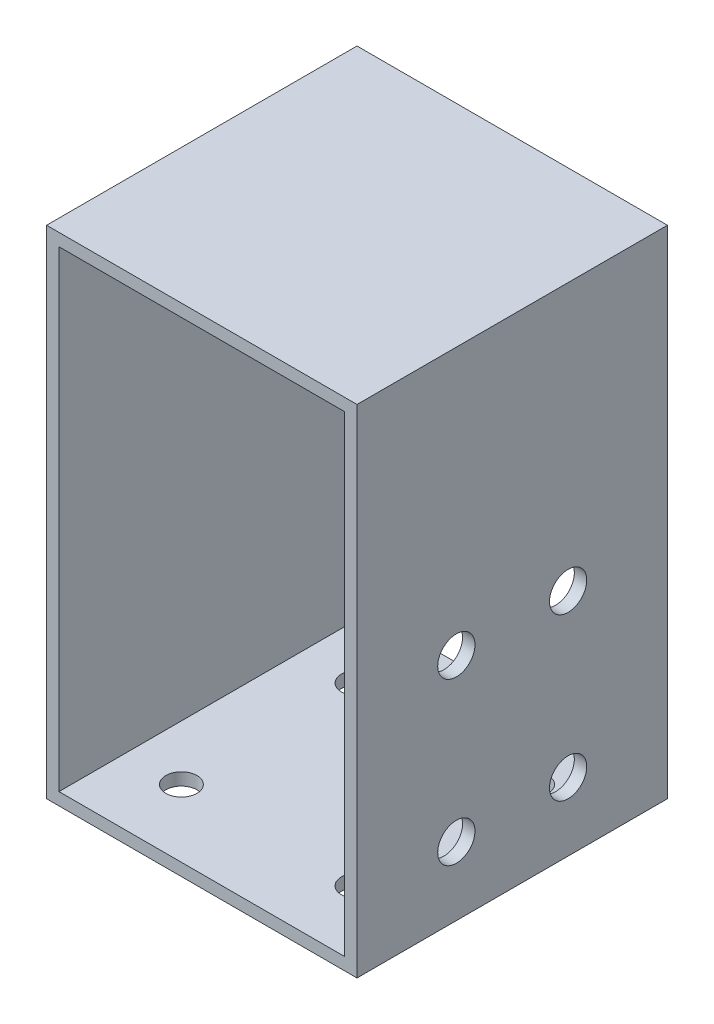
ISO-10303-21;
HEADER;
FILE_DESCRIPTION(('STEP AP214'),'2;1');
FILE_NAME('part.step','',(''),(''),'','','');
FILE_SCHEMA(('AUTOMOTIVE_DESIGN { 1 0 10303 214 1 1 1 1 }'));
ENDSEC;
DATA;
#1=APPLICATION_CONTEXT('core data for automotive mechanical design processes');
#2=APPLICATION_PROTOCOL_DEFINITION('international standard','automotive_design',2000,#1);
#3=PRODUCT_CONTEXT('',#1,'mechanical');
#4=PRODUCT('Part','Part','',(#3));
#5=PRODUCT_RELATED_PRODUCT_CATEGORY('part','',(#4));
#6=PRODUCT_DEFINITION_FORMATION('','',#4);
#7=PRODUCT_DEFINITION_CONTEXT('part definition',#1,'design');
#8=PRODUCT_DEFINITION('design','',#6,#7);
#9=PRODUCT_DEFINITION_SHAPE('','',#8);
#10=(LENGTH_UNIT() NAMED_UNIT(*) SI_UNIT(.MILLI.,.METRE.));
#11=(NAMED_UNIT(*) PLANE_ANGLE_UNIT() SI_UNIT($,.RADIAN.));
#12=(NAMED_UNIT(*) SI_UNIT($,.STERADIAN.) SOLID_ANGLE_UNIT());
#13=UNCERTAINTY_MEASURE_WITH_UNIT(LENGTH_MEASURE(1.E-05),#10,'distance_accuracy_value','');
#14=(GEOMETRIC_REPRESENTATION_CONTEXT(3) GLOBAL_UNCERTAINTY_ASSIGNED_CONTEXT((#13)) GLOBAL_UNIT_ASSIGNED_CONTEXT((#10,
#11,#12)) REPRESENTATION_CONTEXT('',''));
#15=CARTESIAN_POINT('',(0.,0.,0.));
#16=DIRECTION('',(0.,0.,1.));
#17=DIRECTION('',(1.,0.,0.));
#18=AXIS2_PLACEMENT_3D('',#15,#16,#17);
#19=CARTESIAN_POINT('',(0.,0.,12.5));
#20=DIRECTION('',(0.,0.,-1.));
#21=DIRECTION('',(-1.,0.,0.));
#22=AXIS2_PLACEMENT_3D('',#19,#20,#21);
#23=PLANE('',#22);
#24=DIRECTION('',(0.,1.,0.));
#25=VECTOR('',#24,1.);
#26=CARTESIAN_POINT('',(12.5,-20.,12.5));
#27=LINE('',#26,#25);
#28=CARTESIAN_POINT('',(12.5,-20.,12.5));
#29=VERTEX_POINT('',#28);
#30=CARTESIAN_POINT('',(12.5,20.,12.5));
#31=VERTEX_POINT('',#30);
#32=EDGE_CURVE('E138',#29,#31,#27,.T.);
#33=ORIENTED_EDGE('',*,*,#32,.T.);
#34=DIRECTION('',(-1.,0.,0.));
#35=VECTOR('',#34,1.);
#36=CARTESIAN_POINT('',(-12.5,20.,12.5));
#37=LINE('',#36,#35);
#38=CARTESIAN_POINT('',(-12.5,20.,12.5));
#39=VERTEX_POINT('',#38);
#40=EDGE_CURVE('E141',#31,#39,#37,.T.);
#41=ORIENTED_EDGE('',*,*,#40,.T.);
#42=DIRECTION('',(0.,-1.,0.));
#43=VECTOR('',#42,1.);
#44=CARTESIAN_POINT('',(-12.5,-20.,12.5));
#45=LINE('',#44,#43);
#46=CARTESIAN_POINT('',(-12.5,-20.,12.5));
#47=VERTEX_POINT('',#46);
#48=EDGE_CURVE('E144',#39,#47,#45,.T.);
#49=ORIENTED_EDGE('',*,*,#48,.T.);
#50=DIRECTION('',(1.,0.,0.));
#51=VECTOR('',#50,1.);
#52=CARTESIAN_POINT('',(-12.5,-20.,12.5));
#53=LINE('',#52,#51);
#54=EDGE_CURVE('E146',#47,#29,#53,.T.);
#55=ORIENTED_EDGE('',*,*,#54,.T.);
#56=EDGE_LOOP('',(#33,#41,#49,#55));
#57=FACE_BOUND('',#56,.T.);
#58=DIRECTION('',(1.,0.,0.));
#59=VECTOR('',#58,1.);
#60=CARTESIAN_POINT('',(-11.5,-19.,12.5));
#61=LINE('',#60,#59);
#62=CARTESIAN_POINT('',(-11.5,-19.,12.5));
#63=VERTEX_POINT('',#62);
#64=CARTESIAN_POINT('',(11.5,-19.,12.5));
#65=VERTEX_POINT('',#64);
#66=EDGE_CURVE('E100',#63,#65,#61,.T.);
#67=ORIENTED_EDGE('',*,*,#66,.F.);
#68=DIRECTION('',(0.,-1.,0.));
#69=VECTOR('',#68,1.);
#70=CARTESIAN_POINT('',(-11.5,-19.,12.5));
#71=LINE('',#70,#69);
#72=CARTESIAN_POINT('',(-11.5,19.,12.5));
#73=VERTEX_POINT('',#72);
#74=EDGE_CURVE('E122',#73,#63,#71,.T.);
#75=ORIENTED_EDGE('',*,*,#74,.F.);
#76=DIRECTION('',(-1.,0.,0.));
#77=VECTOR('',#76,1.);
#78=CARTESIAN_POINT('',(-11.5,19.,12.5));
#79=LINE('',#78,#77);
#80=CARTESIAN_POINT('',(11.5,19.,12.5));
#81=VERTEX_POINT('',#80);
#82=EDGE_CURVE('E120',#81,#73,#79,.T.);
#83=ORIENTED_EDGE('',*,*,#82,.F.);
#84=DIRECTION('',(0.,1.,0.));
#85=VECTOR('',#84,1.);
#86=CARTESIAN_POINT('',(11.5,-19.,12.5));
#87=LINE('',#86,#85);
#88=EDGE_CURVE('E108',#65,#81,#87,.T.);
#89=ORIENTED_EDGE('',*,*,#88,.F.);
#90=EDGE_LOOP('',(#67,#75,#83,#89));
#91=FACE_BOUND('',#90,.T.);
#92=ADVANCED_FACE('F35',(#57,#91),#23,.F.);
#93=CARTESIAN_POINT('',(0.,0.,-12.5));
#94=DIRECTION('',(0.,0.,-1.));
#95=DIRECTION('',(-1.,0.,0.));
#96=AXIS2_PLACEMENT_3D('',#93,#94,#95);
#97=PLANE('',#96);
#98=DIRECTION('',(0.,1.,0.));
#99=VECTOR('',#98,1.);
#100=CARTESIAN_POINT('',(12.5,-20.,-12.5));
#101=LINE('',#100,#99);
#102=CARTESIAN_POINT('',(12.5,-20.,-12.5));
#103=VERTEX_POINT('',#102);
#104=CARTESIAN_POINT('',(12.5,20.,-12.5));
#105=VERTEX_POINT('',#104);
#106=EDGE_CURVE('E116',#103,#105,#101,.T.);
#107=ORIENTED_EDGE('',*,*,#106,.F.);
#108=DIRECTION('',(1.,0.,0.));
#109=VECTOR('',#108,1.);
#110=CARTESIAN_POINT('',(-12.5,-20.,-12.5));
#111=LINE('',#110,#109);
#112=CARTESIAN_POINT('',(-12.5,-20.,-12.5));
#113=VERTEX_POINT('',#112);
#114=EDGE_CURVE('E142',#113,#103,#111,.T.);
#115=ORIENTED_EDGE('',*,*,#114,.F.);
#116=DIRECTION('',(0.,-1.,0.));
#117=VECTOR('',#116,1.);
#118=CARTESIAN_POINT('',(-12.5,-20.,-12.5));
#119=LINE('',#118,#117);
#120=CARTESIAN_POINT('',(-12.5,20.,-12.5));
#121=VERTEX_POINT('',#120);
#122=EDGE_CURVE('E153',#121,#113,#119,.T.);
#123=ORIENTED_EDGE('',*,*,#122,.F.);
#124=DIRECTION('',(-1.,0.,0.));
#125=VECTOR('',#124,1.);
#126=CARTESIAN_POINT('',(-12.5,20.,-12.5));
#127=LINE('',#126,#125);
#128=EDGE_CURVE('E151',#105,#121,#127,.T.);
#129=ORIENTED_EDGE('',*,*,#128,.F.);
#130=EDGE_LOOP('',(#107,#115,#123,#129));
#131=FACE_BOUND('',#130,.T.);
#132=DIRECTION('',(0.,-1.,0.));
#133=VECTOR('',#132,1.);
#134=CARTESIAN_POINT('',(-11.5,-19.,-12.5));
#135=LINE('',#134,#133);
#136=CARTESIAN_POINT('',(-11.5,19.,-12.5));
#137=VERTEX_POINT('',#136);
#138=CARTESIAN_POINT('',(-11.5,-19.,-12.5));
#139=VERTEX_POINT('',#138);
#140=EDGE_CURVE('E109',#137,#139,#135,.T.);
#141=ORIENTED_EDGE('',*,*,#140,.T.);
#142=DIRECTION('',(1.,0.,0.));
#143=VECTOR('',#142,1.);
#144=CARTESIAN_POINT('',(-11.5,-19.,-12.5));
#145=LINE('',#144,#143);
#146=CARTESIAN_POINT('',(11.5,-19.,-12.5));
#147=VERTEX_POINT('',#146);
#148=EDGE_CURVE('E58',#139,#147,#145,.T.);
#149=ORIENTED_EDGE('',*,*,#148,.T.);
#150=DIRECTION('',(0.,1.,0.));
#151=VECTOR('',#150,1.);
#152=CARTESIAN_POINT('',(11.5,-19.,-12.5));
#153=LINE('',#152,#151);
#154=CARTESIAN_POINT('',(11.5,19.,-12.5));
#155=VERTEX_POINT('',#154);
#156=EDGE_CURVE('E115',#147,#155,#153,.T.);
#157=ORIENTED_EDGE('',*,*,#156,.T.);
#158=DIRECTION('',(-1.,0.,0.));
#159=VECTOR('',#158,1.);
#160=CARTESIAN_POINT('',(-11.5,19.,-12.5));
#161=LINE('',#160,#159);
#162=EDGE_CURVE('E130',#155,#137,#161,.T.);
#163=ORIENTED_EDGE('',*,*,#162,.T.);
#164=EDGE_LOOP('',(#141,#149,#157,#163));
#165=FACE_BOUND('',#164,.T.);
#166=ADVANCED_FACE('F171',(#131,#165),#97,.T.);
#167=CARTESIAN_POINT('',(12.5,-20.,12.5));
#168=DIRECTION('',(-1.,0.,0.));
#169=DIRECTION('',(0.,0.,1.));
#170=AXIS2_PLACEMENT_3D('',#167,#168,#169);
#171=PLANE('',#170);
#172=CARTESIAN_POINT('',(12.5,-1.50000000000105,4.5000000000003));
#173=DIRECTION('',(-1.,0.,0.));
#174=DIRECTION('',(0.,0.,1.));
#175=AXIS2_PLACEMENT_3D('',#172,#173,#174);
#176=CIRCLE('',#175,1.5000000000003);
#177=CARTESIAN_POINT('',(12.5,-1.50000000000105,6.00000000000061));
#178=VERTEX_POINT('',#177);
#179=EDGE_CURVE('E231',#178,#178,#176,.T.);
#180=ORIENTED_EDGE('',*,*,#179,.T.);
#181=EDGE_LOOP('',(#180));
#182=FACE_BOUND('',#181,.T.);
#183=CARTESIAN_POINT('',(12.5,-1.50000000000105,-4.4999999999997));
#184=DIRECTION('',(-1.,0.,0.));
#185=DIRECTION('',(0.,0.,1.));
#186=AXIS2_PLACEMENT_3D('',#183,#184,#185);
#187=CIRCLE('',#186,1.50000000000031);
#188=CARTESIAN_POINT('',(12.5,-1.50000000000105,-2.99999999999939));
#189=VERTEX_POINT('',#188);
#190=EDGE_CURVE('E238',#189,#189,#187,.T.);
#191=ORIENTED_EDGE('',*,*,#190,.T.);
#192=EDGE_LOOP('',(#191));
#193=FACE_BOUND('',#192,.T.);
#194=CARTESIAN_POINT('',(12.5,-14.500000000001,-4.4999999999997));
#195=DIRECTION('',(-1.,0.,0.));
#196=DIRECTION('',(0.,0.,1.));
#197=AXIS2_PLACEMENT_3D('',#194,#195,#196);
#198=CIRCLE('',#197,1.50000000000031);
#199=CARTESIAN_POINT('',(12.5,-14.500000000001,-2.99999999999939));
#200=VERTEX_POINT('',#199);
#201=EDGE_CURVE('E241',#200,#200,#198,.T.);
#202=ORIENTED_EDGE('',*,*,#201,.T.);
#203=EDGE_LOOP('',(#202));
#204=FACE_BOUND('',#203,.T.);
#205=CARTESIAN_POINT('',(12.5,-14.500000000001,4.5000000000003));
#206=DIRECTION('',(-1.,0.,0.));
#207=DIRECTION('',(0.,0.,1.));
#208=AXIS2_PLACEMENT_3D('',#205,#206,#207);
#209=CIRCLE('',#208,1.5000000000003);
#210=CARTESIAN_POINT('',(12.5,-14.500000000001,6.00000000000061));
#211=VERTEX_POINT('',#210);
#212=EDGE_CURVE('E244',#211,#211,#209,.T.);
#213=ORIENTED_EDGE('',*,*,#212,.T.);
#214=EDGE_LOOP('',(#213));
#215=FACE_BOUND('',#214,.T.);
#216=ORIENTED_EDGE('',*,*,#106,.T.);
#217=DIRECTION('',(0.,0.,-1.));
#218=VECTOR('',#217,1.);
#219=CARTESIAN_POINT('',(12.5,20.,12.5));
#220=LINE('',#219,#218);
#221=EDGE_CURVE('E11',#31,#105,#220,.T.);
#222=ORIENTED_EDGE('',*,*,#221,.F.);
#223=ORIENTED_EDGE('',*,*,#32,.F.);
#224=DIRECTION('',(0.,0.,-1.));
#225=VECTOR('',#224,1.);
#226=CARTESIAN_POINT('',(12.5,-20.,12.5));
#227=LINE('',#226,#225);
#228=EDGE_CURVE('E148',#29,#103,#227,.T.);
#229=ORIENTED_EDGE('',*,*,#228,.T.);
#230=EDGE_LOOP('',(#216,#222,#223,#229));
#231=FACE_BOUND('',#230,.T.);
#232=ADVANCED_FACE('F37',(#182,#193,#204,#215,#231),#171,.F.);
#233=CARTESIAN_POINT('',(-12.5,20.,12.5));
#234=DIRECTION('',(0.,-1.,0.));
#235=DIRECTION('',(0.,0.,-1.));
#236=AXIS2_PLACEMENT_3D('',#233,#234,#235);
#237=PLANE('',#236);
#238=ORIENTED_EDGE('',*,*,#128,.T.);
#239=DIRECTION('',(0.,0.,-1.));
#240=VECTOR('',#239,1.);
#241=CARTESIAN_POINT('',(-12.5,20.,12.5));
#242=LINE('',#241,#240);
#243=EDGE_CURVE('E43',#39,#121,#242,.T.);
#244=ORIENTED_EDGE('',*,*,#243,.F.);
#245=ORIENTED_EDGE('',*,*,#40,.F.);
#246=ORIENTED_EDGE('',*,*,#221,.T.);
#247=EDGE_LOOP('',(#238,#244,#245,#246));
#248=FACE_BOUND('',#247,.T.);
#249=ADVANCED_FACE('F181',(#248),#237,.F.);
#250=CARTESIAN_POINT('',(-12.5,-20.,12.5));
#251=DIRECTION('',(1.,0.,0.));
#252=DIRECTION('',(0.,0.,-1.));
#253=AXIS2_PLACEMENT_3D('',#250,#251,#252);
#254=PLANE('',#253);
#255=ORIENTED_EDGE('',*,*,#122,.T.);
#256=DIRECTION('',(0.,0.,-1.));
#257=VECTOR('',#256,1.);
#258=CARTESIAN_POINT('',(-12.5,-20.,12.5));
#259=LINE('',#258,#257);
#260=EDGE_CURVE('E158',#47,#113,#259,.T.);
#261=ORIENTED_EDGE('',*,*,#260,.F.);
#262=ORIENTED_EDGE('',*,*,#48,.F.);
#263=ORIENTED_EDGE('',*,*,#243,.T.);
#264=EDGE_LOOP('',(#255,#261,#262,#263));
#265=FACE_BOUND('',#264,.T.);
#266=ADVANCED_FACE('F165',(#265),#254,.F.);
#267=CARTESIAN_POINT('',(-12.5,-20.,12.5));
#268=DIRECTION('',(0.,1.,0.));
#269=DIRECTION('',(0.,0.,1.));
#270=AXIS2_PLACEMENT_3D('',#267,#268,#269);
#271=PLANE('',#270);
#272=CARTESIAN_POINT('',(-7.0710678118655,-20.,7.07106781186544));
#273=DIRECTION('',(0.,1.,0.));
#274=DIRECTION('',(0.,0.,1.));
#275=AXIS2_PLACEMENT_3D('',#272,#273,#274);
#276=CIRCLE('',#275,1.24999999999999);
#277=CARTESIAN_POINT('',(-7.0710678118655,-20.,8.32106781186543));
#278=VERTEX_POINT('',#277);
#279=EDGE_CURVE('E128',#278,#278,#276,.T.);
#280=ORIENTED_EDGE('',*,*,#279,.T.);
#281=EDGE_LOOP('',(#280));
#282=FACE_BOUND('',#281,.T.);
#283=CARTESIAN_POINT('',(-7.07106781186545,-20.,-7.07106781186549));
#284=DIRECTION('',(0.,1.,0.));
#285=DIRECTION('',(0.,0.,1.));
#286=AXIS2_PLACEMENT_3D('',#283,#284,#285);
#287=CIRCLE('',#286,1.24999999999999);
#288=CARTESIAN_POINT('',(-7.07106781186545,-20.,-5.82106781186549));
#289=VERTEX_POINT('',#288);
#290=EDGE_CURVE('E210',#289,#289,#287,.T.);
#291=ORIENTED_EDGE('',*,*,#290,.T.);
#292=EDGE_LOOP('',(#291));
#293=FACE_BOUND('',#292,.T.);
#294=CARTESIAN_POINT('',(7.07106781186558,-20.,-7.07106781186538));
#295=DIRECTION('',(0.,1.,0.));
#296=DIRECTION('',(0.,0.,1.));
#297=AXIS2_PLACEMENT_3D('',#294,#295,#296);
#298=CIRCLE('',#297,1.24999999999999);
#299=CARTESIAN_POINT('',(7.07106781186558,-20.,-5.8210678118654));
#300=VERTEX_POINT('',#299);
#301=EDGE_CURVE('E214',#300,#300,#298,.T.);
#302=ORIENTED_EDGE('',*,*,#301,.T.);
#303=EDGE_LOOP('',(#302));
#304=FACE_BOUND('',#303,.T.);
#305=CARTESIAN_POINT('',(7.07106781186548,-20.,7.07106781186549));
#306=DIRECTION('',(0.,1.,0.));
#307=DIRECTION('',(0.,0.,1.));
#308=AXIS2_PLACEMENT_3D('',#305,#306,#307);
#309=CIRCLE('',#308,1.24999999999999);
#310=CARTESIAN_POINT('',(7.07106781186548,-20.,8.32106781186548));
#311=VERTEX_POINT('',#310);
#312=EDGE_CURVE('E217',#311,#311,#309,.T.);
#313=ORIENTED_EDGE('',*,*,#312,.T.);
#314=EDGE_LOOP('',(#313));
#315=FACE_BOUND('',#314,.T.);
#316=ORIENTED_EDGE('',*,*,#114,.T.);
#317=ORIENTED_EDGE('',*,*,#228,.F.);
#318=ORIENTED_EDGE('',*,*,#54,.F.);
#319=ORIENTED_EDGE('',*,*,#260,.T.);
#320=EDGE_LOOP('',(#316,#317,#318,#319));
#321=FACE_BOUND('',#320,.T.);
#322=ADVANCED_FACE('F175',(#282,#293,#304,#315,#321),#271,.F.);
#323=CARTESIAN_POINT('',(-11.5,-19.,12.5));
#324=DIRECTION('',(0.,1.,0.));
#325=DIRECTION('',(0.,0.,1.));
#326=AXIS2_PLACEMENT_3D('',#323,#324,#325);
#327=PLANE('',#326);
#328=CARTESIAN_POINT('',(-7.0710678118655,-19.,7.07106781186544));
#329=DIRECTION('',(0.,1.,0.));
#330=DIRECTION('',(0.,0.,1.));
#331=AXIS2_PLACEMENT_3D('',#328,#329,#330);
#332=CIRCLE('',#331,1.24999999999999);
#333=CARTESIAN_POINT('',(-7.0710678118655,-19.,8.32106781186543));
#334=VERTEX_POINT('',#333);
#335=EDGE_CURVE('E227',#334,#334,#332,.T.);
#336=ORIENTED_EDGE('',*,*,#335,.F.);
#337=EDGE_LOOP('',(#336));
#338=FACE_BOUND('',#337,.T.);
#339=CARTESIAN_POINT('',(-7.07106781186545,-19.,-7.07106781186549));
#340=DIRECTION('',(0.,1.,0.));
#341=DIRECTION('',(0.,0.,1.));
#342=AXIS2_PLACEMENT_3D('',#339,#340,#341);
#343=CIRCLE('',#342,1.24999999999999);
#344=CARTESIAN_POINT('',(-7.07106781186545,-19.,-5.82106781186549));
#345=VERTEX_POINT('',#344);
#346=EDGE_CURVE('E230',#345,#345,#343,.T.);
#347=ORIENTED_EDGE('',*,*,#346,.F.);
#348=EDGE_LOOP('',(#347));
#349=FACE_BOUND('',#348,.T.);
#350=CARTESIAN_POINT('',(7.07106781186558,-19.,-7.07106781186538));
#351=DIRECTION('',(0.,1.,0.));
#352=DIRECTION('',(0.,0.,1.));
#353=AXIS2_PLACEMENT_3D('',#350,#351,#352);
#354=CIRCLE('',#353,1.24999999999999);
#355=CARTESIAN_POINT('',(7.07106781186558,-19.,-5.8210678118654));
#356=VERTEX_POINT('',#355);
#357=EDGE_CURVE('E223',#356,#356,#354,.T.);
#358=ORIENTED_EDGE('',*,*,#357,.F.);
#359=EDGE_LOOP('',(#358));
#360=FACE_BOUND('',#359,.T.);
#361=CARTESIAN_POINT('',(7.07106781186548,-19.,7.07106781186549));
#362=DIRECTION('',(0.,1.,0.));
#363=DIRECTION('',(0.,0.,1.));
#364=AXIS2_PLACEMENT_3D('',#361,#362,#363);
#365=CIRCLE('',#364,1.24999999999999);
#366=CARTESIAN_POINT('',(7.07106781186548,-19.,8.32106781186548));
#367=VERTEX_POINT('',#366);
#368=EDGE_CURVE('E219',#367,#367,#365,.T.);
#369=ORIENTED_EDGE('',*,*,#368,.F.);
#370=EDGE_LOOP('',(#369));
#371=FACE_BOUND('',#370,.T.);
#372=ORIENTED_EDGE('',*,*,#148,.F.);
#373=DIRECTION('',(0.,0.,-1.));
#374=VECTOR('',#373,1.);
#375=CARTESIAN_POINT('',(-11.5,-19.,12.5));
#376=LINE('',#375,#374);
#377=EDGE_CURVE('E104',#63,#139,#376,.T.);
#378=ORIENTED_EDGE('',*,*,#377,.F.);
#379=ORIENTED_EDGE('',*,*,#66,.T.);
#380=DIRECTION('',(0.,0.,-1.));
#381=VECTOR('',#380,1.);
#382=CARTESIAN_POINT('',(11.5,-19.,12.5));
#383=LINE('',#382,#381);
#384=EDGE_CURVE('E103',#65,#147,#383,.T.);
#385=ORIENTED_EDGE('',*,*,#384,.T.);
#386=EDGE_LOOP('',(#372,#378,#379,#385));
#387=FACE_BOUND('',#386,.T.);
#388=ADVANCED_FACE('F102',(#338,#349,#360,#371,#387),#327,.T.);
#389=CARTESIAN_POINT('',(11.5,-19.,12.5));
#390=DIRECTION('',(-1.,0.,0.));
#391=DIRECTION('',(0.,0.,1.));
#392=AXIS2_PLACEMENT_3D('',#389,#390,#391);
#393=PLANE('',#392);
#394=CARTESIAN_POINT('',(11.5,-1.50000000000105,4.5000000000003));
#395=DIRECTION('',(-1.,0.,0.));
#396=DIRECTION('',(0.,0.,1.));
#397=AXIS2_PLACEMENT_3D('',#394,#395,#396);
#398=CIRCLE('',#397,1.5000000000003);
#399=CARTESIAN_POINT('',(11.5,-1.50000000000105,6.00000000000061));
#400=VERTEX_POINT('',#399);
#401=EDGE_CURVE('E251',#400,#400,#398,.T.);
#402=ORIENTED_EDGE('',*,*,#401,.F.);
#403=EDGE_LOOP('',(#402));
#404=FACE_BOUND('',#403,.T.);
#405=CARTESIAN_POINT('',(11.5,-1.50000000000105,-4.4999999999997));
#406=DIRECTION('',(-1.,0.,0.));
#407=DIRECTION('',(0.,0.,1.));
#408=AXIS2_PLACEMENT_3D('',#405,#406,#407);
#409=CIRCLE('',#408,1.50000000000031);
#410=CARTESIAN_POINT('',(11.5,-1.50000000000105,-2.99999999999939));
#411=VERTEX_POINT('',#410);
#412=EDGE_CURVE('E254',#411,#411,#409,.T.);
#413=ORIENTED_EDGE('',*,*,#412,.F.);
#414=EDGE_LOOP('',(#413));
#415=FACE_BOUND('',#414,.T.);
#416=CARTESIAN_POINT('',(11.5,-14.500000000001,-4.4999999999997));
#417=DIRECTION('',(-1.,0.,0.));
#418=DIRECTION('',(0.,0.,1.));
#419=AXIS2_PLACEMENT_3D('',#416,#417,#418);
#420=CIRCLE('',#419,1.50000000000031);
#421=CARTESIAN_POINT('',(11.5,-14.500000000001,-2.99999999999939));
#422=VERTEX_POINT('',#421);
#423=EDGE_CURVE('E250',#422,#422,#420,.T.);
#424=ORIENTED_EDGE('',*,*,#423,.F.);
#425=EDGE_LOOP('',(#424));
#426=FACE_BOUND('',#425,.T.);
#427=CARTESIAN_POINT('',(11.5,-14.500000000001,4.5000000000003));
#428=DIRECTION('',(-1.,0.,0.));
#429=DIRECTION('',(0.,0.,1.));
#430=AXIS2_PLACEMENT_3D('',#427,#428,#429);
#431=CIRCLE('',#430,1.5000000000003);
#432=CARTESIAN_POINT('',(11.5,-14.500000000001,6.00000000000061));
#433=VERTEX_POINT('',#432);
#434=EDGE_CURVE('E247',#433,#433,#431,.T.);
#435=ORIENTED_EDGE('',*,*,#434,.F.);
#436=EDGE_LOOP('',(#435));
#437=FACE_BOUND('',#436,.T.);
#438=ORIENTED_EDGE('',*,*,#156,.F.);
#439=ORIENTED_EDGE('',*,*,#384,.F.);
#440=ORIENTED_EDGE('',*,*,#88,.T.);
#441=DIRECTION('',(0.,0.,-1.));
#442=VECTOR('',#441,1.);
#443=CARTESIAN_POINT('',(11.5,19.,12.5));
#444=LINE('',#443,#442);
#445=EDGE_CURVE('E117',#81,#155,#444,.T.);
#446=ORIENTED_EDGE('',*,*,#445,.T.);
#447=EDGE_LOOP('',(#438,#439,#440,#446));
#448=FACE_BOUND('',#447,.T.);
#449=ADVANCED_FACE('F112',(#404,#415,#426,#437,#448),#393,.T.);
#450=CARTESIAN_POINT('',(-11.5,19.,12.5));
#451=DIRECTION('',(0.,-1.,0.));
#452=DIRECTION('',(0.,0.,-1.));
#453=AXIS2_PLACEMENT_3D('',#450,#451,#452);
#454=PLANE('',#453);
#455=ORIENTED_EDGE('',*,*,#162,.F.);
#456=ORIENTED_EDGE('',*,*,#445,.F.);
#457=ORIENTED_EDGE('',*,*,#82,.T.);
#458=DIRECTION('',(0.,0.,-1.));
#459=VECTOR('',#458,1.);
#460=CARTESIAN_POINT('',(-11.5,19.,12.5));
#461=LINE('',#460,#459);
#462=EDGE_CURVE('E50',#73,#137,#461,.T.);
#463=ORIENTED_EDGE('',*,*,#462,.T.);
#464=EDGE_LOOP('',(#455,#456,#457,#463));
#465=FACE_BOUND('',#464,.T.);
#466=ADVANCED_FACE('F265',(#465),#454,.T.);
#467=CARTESIAN_POINT('',(-11.5,-19.,12.5));
#468=DIRECTION('',(1.,0.,0.));
#469=DIRECTION('',(0.,0.,-1.));
#470=AXIS2_PLACEMENT_3D('',#467,#468,#469);
#471=PLANE('',#470);
#472=ORIENTED_EDGE('',*,*,#140,.F.);
#473=ORIENTED_EDGE('',*,*,#462,.F.);
#474=ORIENTED_EDGE('',*,*,#74,.T.);
#475=ORIENTED_EDGE('',*,*,#377,.T.);
#476=EDGE_LOOP('',(#472,#473,#474,#475));
#477=FACE_BOUND('',#476,.T.);
#478=ADVANCED_FACE('F299',(#477),#471,.T.);
#479=CARTESIAN_POINT('',(7.07106781186548,-29.,7.07106781186549));
#480=DIRECTION('',(0.,1.,0.));
#481=DIRECTION('',(0.,0.,1.));
#482=AXIS2_PLACEMENT_3D('',#479,#480,#481);
#483=CYLINDRICAL_SURFACE('',#482,1.24999999999999);
#484=ORIENTED_EDGE('',*,*,#368,.T.);
#485=EDGE_LOOP('',(#484));
#486=FACE_BOUND('',#485,.T.);
#487=ORIENTED_EDGE('',*,*,#312,.F.);
#488=EDGE_LOOP('',(#487));
#489=FACE_BOUND('',#488,.T.);
#490=ADVANCED_FACE('F292',(#486,#489),#483,.F.);
#491=CARTESIAN_POINT('',(7.07106781186558,-29.,-7.07106781186538));
#492=DIRECTION('',(0.,1.,0.));
#493=DIRECTION('',(0.,0.,1.));
#494=AXIS2_PLACEMENT_3D('',#491,#492,#493);
#495=CYLINDRICAL_SURFACE('',#494,1.24999999999999);
#496=ORIENTED_EDGE('',*,*,#357,.T.);
#497=EDGE_LOOP('',(#496));
#498=FACE_BOUND('',#497,.T.);
#499=ORIENTED_EDGE('',*,*,#301,.F.);
#500=EDGE_LOOP('',(#499));
#501=FACE_BOUND('',#500,.T.);
#502=ADVANCED_FACE('F289',(#498,#501),#495,.F.);
#503=CARTESIAN_POINT('',(-7.07106781186545,-29.,-7.07106781186549));
#504=DIRECTION('',(0.,1.,0.));
#505=DIRECTION('',(0.,0.,1.));
#506=AXIS2_PLACEMENT_3D('',#503,#504,#505);
#507=CYLINDRICAL_SURFACE('',#506,1.24999999999999);
#508=ORIENTED_EDGE('',*,*,#346,.T.);
#509=EDGE_LOOP('',(#508));
#510=FACE_BOUND('',#509,.T.);
#511=ORIENTED_EDGE('',*,*,#290,.F.);
#512=EDGE_LOOP('',(#511));
#513=FACE_BOUND('',#512,.T.);
#514=ADVANCED_FACE('F282',(#510,#513),#507,.F.);
#515=CARTESIAN_POINT('',(-7.0710678118655,-29.,7.07106781186544));
#516=DIRECTION('',(0.,1.,0.));
#517=DIRECTION('',(0.,0.,1.));
#518=AXIS2_PLACEMENT_3D('',#515,#516,#517);
#519=CYLINDRICAL_SURFACE('',#518,1.24999999999999);
#520=ORIENTED_EDGE('',*,*,#335,.T.);
#521=EDGE_LOOP('',(#520));
#522=FACE_BOUND('',#521,.T.);
#523=ORIENTED_EDGE('',*,*,#279,.F.);
#524=EDGE_LOOP('',(#523));
#525=FACE_BOUND('',#524,.T.);
#526=ADVANCED_FACE('F272',(#522,#525),#519,.F.);
#527=CARTESIAN_POINT('',(21.5,-14.500000000001,4.5000000000003));
#528=DIRECTION('',(-1.,0.,0.));
#529=DIRECTION('',(0.,0.,1.));
#530=AXIS2_PLACEMENT_3D('',#527,#528,#529);
#531=CYLINDRICAL_SURFACE('',#530,1.5000000000003);
#532=ORIENTED_EDGE('',*,*,#434,.T.);
#533=EDGE_LOOP('',(#532));
#534=FACE_BOUND('',#533,.T.);
#535=ORIENTED_EDGE('',*,*,#212,.F.);
#536=EDGE_LOOP('',(#535));
#537=FACE_BOUND('',#536,.T.);
#538=ADVANCED_FACE('F269',(#534,#537),#531,.F.);
#539=CARTESIAN_POINT('',(21.5,-14.500000000001,-4.4999999999997));
#540=DIRECTION('',(-1.,0.,0.));
#541=DIRECTION('',(0.,0.,1.));
#542=AXIS2_PLACEMENT_3D('',#539,#540,#541);
#543=CYLINDRICAL_SURFACE('',#542,1.50000000000031);
#544=ORIENTED_EDGE('',*,*,#423,.T.);
#545=EDGE_LOOP('',(#544));
#546=FACE_BOUND('',#545,.T.);
#547=ORIENTED_EDGE('',*,*,#201,.F.);
#548=EDGE_LOOP('',(#547));
#549=FACE_BOUND('',#548,.T.);
#550=ADVANCED_FACE('F260',(#546,#549),#543,.F.);
#551=CARTESIAN_POINT('',(21.5,-1.50000000000105,-4.4999999999997));
#552=DIRECTION('',(-1.,0.,0.));
#553=DIRECTION('',(0.,0.,1.));
#554=AXIS2_PLACEMENT_3D('',#551,#552,#553);
#555=CYLINDRICAL_SURFACE('',#554,1.50000000000031);
#556=ORIENTED_EDGE('',*,*,#412,.T.);
#557=EDGE_LOOP('',(#556));
#558=FACE_BOUND('',#557,.T.);
#559=ORIENTED_EDGE('',*,*,#190,.F.);
#560=EDGE_LOOP('',(#559));
#561=FACE_BOUND('',#560,.T.);
#562=ADVANCED_FACE('F280',(#558,#561),#555,.F.);
#563=CARTESIAN_POINT('',(21.5,-1.50000000000105,4.5000000000003));
#564=DIRECTION('',(-1.,0.,0.));
#565=DIRECTION('',(0.,0.,1.));
#566=AXIS2_PLACEMENT_3D('',#563,#564,#565);
#567=CYLINDRICAL_SURFACE('',#566,1.5000000000003);
#568=ORIENTED_EDGE('',*,*,#401,.T.);
#569=EDGE_LOOP('',(#568));
#570=FACE_BOUND('',#569,.T.);
#571=ORIENTED_EDGE('',*,*,#179,.F.);
#572=EDGE_LOOP('',(#571));
#573=FACE_BOUND('',#572,.T.);
#574=ADVANCED_FACE('F287',(#570,#573),#567,.F.);
#575=CLOSED_SHELL('',(#92,#166,#232,#249,#266,#322,#388,#449,#466,#478,#490,#502,#514,#526,#538,
#550,#562,#574));
#576=MANIFOLD_SOLID_BREP('B2',#575);
#577=ADVANCED_BREP_SHAPE_REPRESENTATION('',(#18,#576),#14);
#578=SHAPE_DEFINITION_REPRESENTATION(#9,#577);
ENDSEC;
END-ISO-10303-21;
